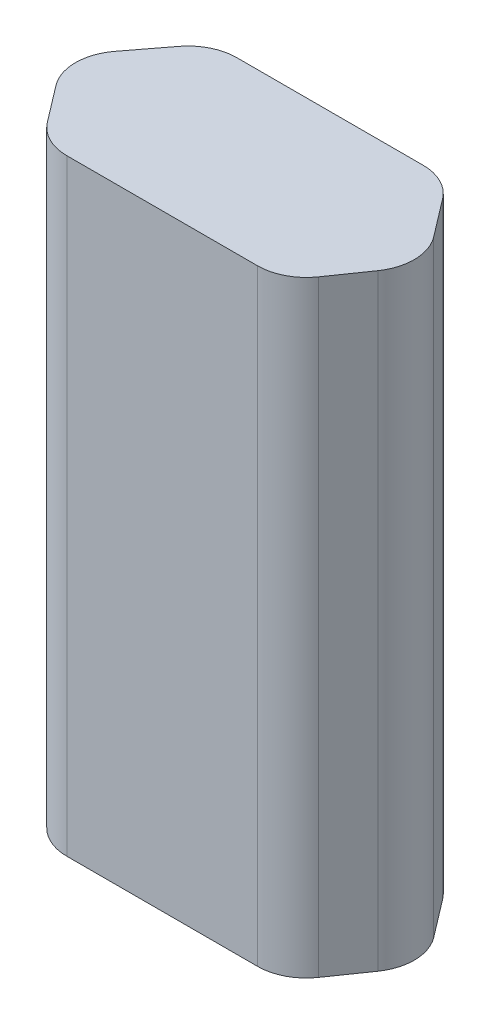
ISO-10303-21;
HEADER;
FILE_DESCRIPTION(('STEP AP214'),'2;1');
FILE_NAME('part.step','',(''),(''),'','','');
FILE_SCHEMA(('AUTOMOTIVE_DESIGN { 1 0 10303 214 1 1 1 1 }'));
ENDSEC;
DATA;
#1=APPLICATION_CONTEXT('core data for automotive mechanical design processes');
#2=APPLICATION_PROTOCOL_DEFINITION('international standard','automotive_design',2000,#1);
#3=PRODUCT_CONTEXT('',#1,'mechanical');
#4=PRODUCT('Part','Part','',(#3));
#5=PRODUCT_RELATED_PRODUCT_CATEGORY('part','',(#4));
#6=PRODUCT_DEFINITION_FORMATION('','',#4);
#7=PRODUCT_DEFINITION_CONTEXT('part definition',#1,'design');
#8=PRODUCT_DEFINITION('design','',#6,#7);
#9=PRODUCT_DEFINITION_SHAPE('','',#8);
#10=(LENGTH_UNIT() NAMED_UNIT(*) SI_UNIT(.MILLI.,.METRE.));
#11=(NAMED_UNIT(*) PLANE_ANGLE_UNIT() SI_UNIT($,.RADIAN.));
#12=(NAMED_UNIT(*) SI_UNIT($,.STERADIAN.) SOLID_ANGLE_UNIT());
#13=UNCERTAINTY_MEASURE_WITH_UNIT(LENGTH_MEASURE(1.E-05),#10,'distance_accuracy_value','');
#14=(GEOMETRIC_REPRESENTATION_CONTEXT(3) GLOBAL_UNCERTAINTY_ASSIGNED_CONTEXT((#13)) GLOBAL_UNIT_ASSIGNED_CONTEXT((#10,
#11,#12)) REPRESENTATION_CONTEXT('',''));
#15=CARTESIAN_POINT('',(0.,0.,0.));
#16=DIRECTION('',(0.,0.,1.));
#17=DIRECTION('',(1.,0.,0.));
#18=AXIS2_PLACEMENT_3D('',#15,#16,#17);
#19=CARTESIAN_POINT('',(-7.5,25.,0.));
#20=DIRECTION('',(0.795203484748346,0.,-0.606342657120614));
#21=DIRECTION('',(-0.606342657120614,0.,-0.795203484748346));
#22=AXIS2_PLACEMENT_3D('',#19,#20,#21);
#23=PLANE('',#22);
#24=DIRECTION('',(0.606342657120614,0.,0.795203484748346));
#25=VECTOR('',#24,1.);
#26=CARTESIAN_POINT('',(-7.5,0.,0.));
#27=LINE('',#26,#25);
#28=CARTESIAN_POINT('',(-6.57532744789106,0.,1.21268531424123));
#29=VERTEX_POINT('',#28);
#30=CARTESIAN_POINT('',(-5.43157744789106,0.,2.71268531424123));
#31=VERTEX_POINT('',#30);
#32=EDGE_CURVE('E154',#29,#31,#27,.T.);
#33=ORIENTED_EDGE('',*,*,#32,.T.);
#34=DIRECTION('',(0.,-1.,0.));
#35=VECTOR('',#34,1.);
#36=CARTESIAN_POINT('',(-5.43157744789106,25.,2.71268531424123));
#37=LINE('',#36,#35);
#38=CARTESIAN_POINT('',(-5.43157744789106,25.,2.71268531424123));
#39=VERTEX_POINT('',#38);
#40=EDGE_CURVE('E200',#31,#39,#37,.F.);
#41=ORIENTED_EDGE('',*,*,#40,.T.);
#42=DIRECTION('',(0.606342657120614,0.,0.795203484748346));
#43=VECTOR('',#42,1.);
#44=CARTESIAN_POINT('',(-7.5,25.,0.));
#45=LINE('',#44,#43);
#46=CARTESIAN_POINT('',(-6.57532744789106,25.,1.21268531424123));
#47=VERTEX_POINT('',#46);
#48=EDGE_CURVE('E162',#47,#39,#45,.T.);
#49=ORIENTED_EDGE('',*,*,#48,.F.);
#50=DIRECTION('',(0.,-1.,0.));
#51=VECTOR('',#50,1.);
#52=CARTESIAN_POINT('',(-6.57532744789106,25.,1.21268531424123));
#53=LINE('',#52,#51);
#54=EDGE_CURVE('E197',#47,#29,#53,.T.);
#55=ORIENTED_EDGE('',*,*,#54,.T.);
#56=EDGE_LOOP('',(#33,#41,#49,#55));
#57=FACE_BOUND('',#56,.T.);
#58=ADVANCED_FACE('F32',(#57),#23,.F.);
#59=CARTESIAN_POINT('',(-4.83125,25.,3.5));
#60=DIRECTION('',(0.,0.,-1.));
#61=DIRECTION('',(-1.,0.,0.));
#62=AXIS2_PLACEMENT_3D('',#59,#60,#61);
#63=PLANE('',#62);
#64=DIRECTION('',(1.,0.,0.));
#65=VECTOR('',#64,1.);
#66=CARTESIAN_POINT('',(-4.83125,0.,3.5));
#67=LINE('',#66,#65);
#68=CARTESIAN_POINT('',(-3.84117047839437,0.,3.5));
#69=VERTEX_POINT('',#68);
#70=CARTESIAN_POINT('',(4.02285301150582,0.,3.5));
#71=VERTEX_POINT('',#70);
#72=EDGE_CURVE('E149',#69,#71,#67,.T.);
#73=ORIENTED_EDGE('',*,*,#72,.T.);
#74=DIRECTION('',(0.,-1.,0.));
#75=VECTOR('',#74,1.);
#76=CARTESIAN_POINT('',(4.02285301150582,25.,3.5));
#77=LINE('',#76,#75);
#78=CARTESIAN_POINT('',(4.02285301150582,25.,3.5));
#79=VERTEX_POINT('',#78);
#80=EDGE_CURVE('E127',#71,#79,#77,.F.);
#81=ORIENTED_EDGE('',*,*,#80,.T.);
#82=DIRECTION('',(1.,0.,0.));
#83=VECTOR('',#82,1.);
#84=CARTESIAN_POINT('',(-4.83125,25.,3.5));
#85=LINE('',#84,#83);
#86=CARTESIAN_POINT('',(-3.84117047839437,25.,3.5));
#87=VERTEX_POINT('',#86);
#88=EDGE_CURVE('E214',#87,#79,#85,.T.);
#89=ORIENTED_EDGE('',*,*,#88,.F.);
#90=DIRECTION('',(0.,-1.,0.));
#91=VECTOR('',#90,1.);
#92=CARTESIAN_POINT('',(-3.84117047839437,25.,3.5));
#93=LINE('',#92,#91);
#94=EDGE_CURVE('E132',#87,#69,#93,.T.);
#95=ORIENTED_EDGE('',*,*,#94,.T.);
#96=EDGE_LOOP('',(#73,#81,#89,#95));
#97=FACE_BOUND('',#96,.T.);
#98=ADVANCED_FACE('F219',(#97),#63,.F.);
#99=CARTESIAN_POINT('',(7.5,25.,0.));
#100=DIRECTION('',(-0.821293612884526,0.,-0.570505741807287));
#101=DIRECTION('',(-0.570505741807287,0.,0.821293612884526));
#102=AXIS2_PLACEMENT_3D('',#99,#100,#101);
#103=PLANE('',#102);
#104=DIRECTION('',(0.570505741807287,0.,-0.821293612884526));
#105=VECTOR('',#104,1.);
#106=CARTESIAN_POINT('',(7.5,25.,0.));
#107=LINE('',#106,#105);
#108=CARTESIAN_POINT('',(5.66544023727488,25.,2.64101148361457));
#109=VERTEX_POINT('',#108);
#110=CARTESIAN_POINT('',(6.6693164561715,25.,1.1958426337891));
#111=VERTEX_POINT('',#110);
#112=EDGE_CURVE('E142',#109,#111,#107,.T.);
#113=ORIENTED_EDGE('',*,*,#112,.F.);
#114=DIRECTION('',(0.,-1.,0.));
#115=VECTOR('',#114,1.);
#116=CARTESIAN_POINT('',(5.66544023727488,25.,2.64101148361457));
#117=LINE('',#116,#115);
#118=CARTESIAN_POINT('',(5.66544023727488,0.,2.64101148361457));
#119=VERTEX_POINT('',#118);
#120=EDGE_CURVE('E126',#109,#119,#117,.T.);
#121=ORIENTED_EDGE('',*,*,#120,.T.);
#122=DIRECTION('',(0.570505741807287,0.,-0.821293612884526));
#123=VECTOR('',#122,1.);
#124=CARTESIAN_POINT('',(7.5,0.,0.));
#125=LINE('',#124,#123);
#126=CARTESIAN_POINT('',(6.6693164561715,0.,1.1958426337891));
#127=VERTEX_POINT('',#126);
#128=EDGE_CURVE('E139',#119,#127,#125,.T.);
#129=ORIENTED_EDGE('',*,*,#128,.T.);
#130=DIRECTION('',(0.,-1.,0.));
#131=VECTOR('',#130,1.);
#132=CARTESIAN_POINT('',(6.6693164561715,25.,1.1958426337891));
#133=LINE('',#132,#131);
#134=EDGE_CURVE('E144',#127,#111,#133,.F.);
#135=ORIENTED_EDGE('',*,*,#134,.T.);
#136=EDGE_LOOP('',(#113,#121,#129,#135));
#137=FACE_BOUND('',#136,.T.);
#138=ADVANCED_FACE('F138',(#137),#103,.F.);
#139=CARTESIAN_POINT('',(7.5,25.,0.));
#140=DIRECTION('',(-0.795203484748346,0.,0.606342657120614));
#141=DIRECTION('',(0.606342657120614,0.,0.795203484748346));
#142=AXIS2_PLACEMENT_3D('',#139,#140,#141);
#143=PLANE('',#142);
#144=DIRECTION('',(-0.606342657120614,0.,-0.795203484748346));
#145=VECTOR('',#144,1.);
#146=CARTESIAN_POINT('',(7.5,25.,0.));
#147=LINE('',#146,#145);
#148=CARTESIAN_POINT('',(6.61713619989914,25.,-1.1578541640667));
#149=VERTEX_POINT('',#148);
#150=CARTESIAN_POINT('',(5.43157744789106,25.,-2.71268531424123));
#151=VERTEX_POINT('',#150);
#152=EDGE_CURVE('E225',#149,#151,#147,.T.);
#153=ORIENTED_EDGE('',*,*,#152,.F.);
#154=DIRECTION('',(0.,-1.,0.));
#155=VECTOR('',#154,1.);
#156=CARTESIAN_POINT('',(6.61713619989914,25.,-1.1578541640667));
#157=LINE('',#156,#155);
#158=CARTESIAN_POINT('',(6.61713619989914,0.,-1.1578541640667));
#159=VERTEX_POINT('',#158);
#160=EDGE_CURVE('E189',#149,#159,#157,.T.);
#161=ORIENTED_EDGE('',*,*,#160,.T.);
#162=DIRECTION('',(-0.606342657120614,0.,-0.795203484748346));
#163=VECTOR('',#162,1.);
#164=CARTESIAN_POINT('',(7.5,0.,0.));
#165=LINE('',#164,#163);
#166=CARTESIAN_POINT('',(5.43157744789106,0.,-2.71268531424123));
#167=VERTEX_POINT('',#166);
#168=EDGE_CURVE('E148',#159,#167,#165,.T.);
#169=ORIENTED_EDGE('',*,*,#168,.T.);
#170=DIRECTION('',(0.,-1.,0.));
#171=VECTOR('',#170,1.);
#172=CARTESIAN_POINT('',(5.43157744789106,25.,-2.71268531424123));
#173=LINE('',#172,#171);
#174=EDGE_CURVE('E187',#167,#151,#173,.F.);
#175=ORIENTED_EDGE('',*,*,#174,.T.);
#176=EDGE_LOOP('',(#153,#161,#169,#175));
#177=FACE_BOUND('',#176,.T.);
#178=ADVANCED_FACE('F235',(#177),#143,.F.);
#179=CARTESIAN_POINT('',(-4.83125,25.,-3.5));
#180=DIRECTION('',(0.,0.,1.));
#181=DIRECTION('',(1.,0.,0.));
#182=AXIS2_PLACEMENT_3D('',#179,#180,#181);
#183=PLANE('',#182);
#184=DIRECTION('',(-1.,0.,0.));
#185=VECTOR('',#184,1.);
#186=CARTESIAN_POINT('',(-4.83125,25.,-3.5));
#187=LINE('',#186,#185);
#188=CARTESIAN_POINT('',(3.84117047839437,25.,-3.5));
#189=VERTEX_POINT('',#188);
#190=CARTESIAN_POINT('',(-3.84117047839437,25.,-3.5));
#191=VERTEX_POINT('',#190);
#192=EDGE_CURVE('E223',#189,#191,#187,.T.);
#193=ORIENTED_EDGE('',*,*,#192,.F.);
#194=DIRECTION('',(0.,-1.,0.));
#195=VECTOR('',#194,1.);
#196=CARTESIAN_POINT('',(3.84117047839437,25.,-3.5));
#197=LINE('',#196,#195);
#198=CARTESIAN_POINT('',(3.84117047839437,0.,-3.5));
#199=VERTEX_POINT('',#198);
#200=EDGE_CURVE('E194',#189,#199,#197,.T.);
#201=ORIENTED_EDGE('',*,*,#200,.T.);
#202=DIRECTION('',(-1.,0.,0.));
#203=VECTOR('',#202,1.);
#204=CARTESIAN_POINT('',(-4.83125,0.,-3.5));
#205=LINE('',#204,#203);
#206=CARTESIAN_POINT('',(-3.84117047839437,0.,-3.5));
#207=VERTEX_POINT('',#206);
#208=EDGE_CURVE('E152',#199,#207,#205,.T.);
#209=ORIENTED_EDGE('',*,*,#208,.T.);
#210=DIRECTION('',(0.,-1.,0.));
#211=VECTOR('',#210,1.);
#212=CARTESIAN_POINT('',(-3.84117047839437,25.,-3.5));
#213=LINE('',#212,#211);
#214=EDGE_CURVE('E192',#207,#191,#213,.F.);
#215=ORIENTED_EDGE('',*,*,#214,.T.);
#216=EDGE_LOOP('',(#193,#201,#209,#215));
#217=FACE_BOUND('',#216,.T.);
#218=ADVANCED_FACE('F244',(#217),#183,.F.);
#219=CARTESIAN_POINT('',(-7.5,25.,0.));
#220=DIRECTION('',(0.795203484748346,0.,0.606342657120614));
#221=DIRECTION('',(0.606342657120614,0.,-0.795203484748346));
#222=AXIS2_PLACEMENT_3D('',#219,#220,#221);
#223=PLANE('',#222);
#224=DIRECTION('',(-0.606342657120614,0.,0.795203484748346));
#225=VECTOR('',#224,1.);
#226=CARTESIAN_POINT('',(-7.5,25.,0.));
#227=LINE('',#226,#225);
#228=CARTESIAN_POINT('',(-5.43157744789106,25.,-2.71268531424123));
#229=VERTEX_POINT('',#228);
#230=CARTESIAN_POINT('',(-6.57532744789106,25.,-1.21268531424123));
#231=VERTEX_POINT('',#230);
#232=EDGE_CURVE('E163',#229,#231,#227,.T.);
#233=ORIENTED_EDGE('',*,*,#232,.F.);
#234=DIRECTION('',(0.,-1.,0.));
#235=VECTOR('',#234,1.);
#236=CARTESIAN_POINT('',(-5.43157744789106,25.,-2.71268531424123));
#237=LINE('',#236,#235);
#238=CARTESIAN_POINT('',(-5.43157744789106,0.,-2.71268531424123));
#239=VERTEX_POINT('',#238);
#240=EDGE_CURVE('E11',#229,#239,#237,.T.);
#241=ORIENTED_EDGE('',*,*,#240,.T.);
#242=DIRECTION('',(-0.606342657120614,0.,0.795203484748346));
#243=VECTOR('',#242,1.);
#244=CARTESIAN_POINT('',(-7.5,0.,0.));
#245=LINE('',#244,#243);
#246=CARTESIAN_POINT('',(-6.57532744789106,0.,-1.21268531424123));
#247=VERTEX_POINT('',#246);
#248=EDGE_CURVE('E160',#239,#247,#245,.T.);
#249=ORIENTED_EDGE('',*,*,#248,.T.);
#250=DIRECTION('',(0.,-1.,0.));
#251=VECTOR('',#250,1.);
#252=CARTESIAN_POINT('',(-6.57532744789106,25.,-1.21268531424123));
#253=LINE('',#252,#251);
#254=EDGE_CURVE('E40',#247,#231,#253,.F.);
#255=ORIENTED_EDGE('',*,*,#254,.T.);
#256=EDGE_LOOP('',(#233,#241,#249,#255));
#257=FACE_BOUND('',#256,.T.);
#258=ADVANCED_FACE('F249',(#257),#223,.F.);
#259=CARTESIAN_POINT('',(0.,25.,0.));
#260=DIRECTION('',(0.,1.,0.));
#261=DIRECTION('',(0.,0.,1.));
#262=AXIS2_PLACEMENT_3D('',#259,#260,#261);
#263=PLANE('',#262);
#264=ORIENTED_EDGE('',*,*,#88,.T.);
#265=CARTESIAN_POINT('',(4.02285301150582,25.,1.5));
#266=DIRECTION('',(0.,1.,0.));
#267=DIRECTION('',(0.,0.,1.));
#268=AXIS2_PLACEMENT_3D('',#265,#266,#267);
#269=CIRCLE('',#268,2.);
#270=EDGE_CURVE('E185',#79,#109,#269,.T.);
#271=ORIENTED_EDGE('',*,*,#270,.T.);
#272=ORIENTED_EDGE('',*,*,#112,.T.);
#273=CARTESIAN_POINT('',(5.02672923040245,25.,0.0548311501745267));
#274=DIRECTION('',(0.,1.,0.));
#275=DIRECTION('',(0.,0.,1.));
#276=AXIS2_PLACEMENT_3D('',#273,#274,#275);
#277=CIRCLE('',#276,2.);
#278=EDGE_CURVE('E183',#111,#149,#277,.T.);
#279=ORIENTED_EDGE('',*,*,#278,.T.);
#280=ORIENTED_EDGE('',*,*,#152,.T.);
#281=CARTESIAN_POINT('',(3.84117047839437,25.,-1.5));
#282=DIRECTION('',(0.,1.,0.));
#283=DIRECTION('',(0.,0.,1.));
#284=AXIS2_PLACEMENT_3D('',#281,#282,#283);
#285=CIRCLE('',#284,2.);
#286=EDGE_CURVE('E181',#151,#189,#285,.T.);
#287=ORIENTED_EDGE('',*,*,#286,.T.);
#288=ORIENTED_EDGE('',*,*,#192,.T.);
#289=CARTESIAN_POINT('',(-3.84117047839437,25.,-1.5));
#290=DIRECTION('',(0.,1.,0.));
#291=DIRECTION('',(0.,0.,1.));
#292=AXIS2_PLACEMENT_3D('',#289,#290,#291);
#293=CIRCLE('',#292,2.);
#294=EDGE_CURVE('E53',#191,#229,#293,.T.);
#295=ORIENTED_EDGE('',*,*,#294,.T.);
#296=ORIENTED_EDGE('',*,*,#232,.T.);
#297=CARTESIAN_POINT('',(-4.98492047839437,25.,0.));
#298=DIRECTION('',(0.,1.,0.));
#299=DIRECTION('',(0.,0.,1.));
#300=AXIS2_PLACEMENT_3D('',#297,#298,#299);
#301=CIRCLE('',#300,2.);
#302=EDGE_CURVE('E176',#231,#47,#301,.T.);
#303=ORIENTED_EDGE('',*,*,#302,.T.);
#304=ORIENTED_EDGE('',*,*,#48,.T.);
#305=CARTESIAN_POINT('',(-3.84117047839437,25.,1.5));
#306=DIRECTION('',(0.,1.,0.));
#307=DIRECTION('',(0.,0.,1.));
#308=AXIS2_PLACEMENT_3D('',#305,#306,#307);
#309=CIRCLE('',#308,2.);
#310=EDGE_CURVE('E179',#39,#87,#309,.T.);
#311=ORIENTED_EDGE('',*,*,#310,.T.);
#312=EDGE_LOOP('',(#264,#271,#272,#279,#280,#287,#288,#295,#296,#303,#304,#311));
#313=FACE_BOUND('',#312,.T.);
#314=ADVANCED_FACE('F211',(#313),#263,.T.);
#315=CARTESIAN_POINT('',(0.,0.,0.));
#316=DIRECTION('',(0.,1.,0.));
#317=DIRECTION('',(0.,0.,1.));
#318=AXIS2_PLACEMENT_3D('',#315,#316,#317);
#319=PLANE('',#318);
#320=ORIENTED_EDGE('',*,*,#128,.F.);
#321=CARTESIAN_POINT('',(4.02285301150582,0.,1.5));
#322=DIRECTION('',(0.,1.,0.));
#323=DIRECTION('',(0.,0.,1.));
#324=AXIS2_PLACEMENT_3D('',#321,#322,#323);
#325=CIRCLE('',#324,2.);
#326=EDGE_CURVE('E122',#119,#71,#325,.F.);
#327=ORIENTED_EDGE('',*,*,#326,.T.);
#328=ORIENTED_EDGE('',*,*,#72,.F.);
#329=CARTESIAN_POINT('',(-3.84117047839437,0.,1.5));
#330=DIRECTION('',(0.,1.,0.));
#331=DIRECTION('',(0.,0.,1.));
#332=AXIS2_PLACEMENT_3D('',#329,#330,#331);
#333=CIRCLE('',#332,2.);
#334=EDGE_CURVE('E168',#69,#31,#333,.F.);
#335=ORIENTED_EDGE('',*,*,#334,.T.);
#336=ORIENTED_EDGE('',*,*,#32,.F.);
#337=CARTESIAN_POINT('',(-4.98492047839437,0.,0.));
#338=DIRECTION('',(0.,1.,0.));
#339=DIRECTION('',(0.,0.,1.));
#340=AXIS2_PLACEMENT_3D('',#337,#338,#339);
#341=CIRCLE('',#340,2.);
#342=EDGE_CURVE('E143',#29,#247,#341,.F.);
#343=ORIENTED_EDGE('',*,*,#342,.T.);
#344=ORIENTED_EDGE('',*,*,#248,.F.);
#345=CARTESIAN_POINT('',(-3.84117047839437,0.,-1.5));
#346=DIRECTION('',(0.,1.,0.));
#347=DIRECTION('',(0.,0.,1.));
#348=AXIS2_PLACEMENT_3D('',#345,#346,#347);
#349=CIRCLE('',#348,2.);
#350=EDGE_CURVE('E166',#239,#207,#349,.F.);
#351=ORIENTED_EDGE('',*,*,#350,.T.);
#352=ORIENTED_EDGE('',*,*,#208,.F.);
#353=CARTESIAN_POINT('',(3.84117047839437,0.,-1.5));
#354=DIRECTION('',(0.,1.,0.));
#355=DIRECTION('',(0.,0.,1.));
#356=AXIS2_PLACEMENT_3D('',#353,#354,#355);
#357=CIRCLE('',#356,2.);
#358=EDGE_CURVE('E170',#199,#167,#357,.F.);
#359=ORIENTED_EDGE('',*,*,#358,.T.);
#360=ORIENTED_EDGE('',*,*,#168,.F.);
#361=CARTESIAN_POINT('',(5.02672923040245,0.,0.0548311501745267));
#362=DIRECTION('',(0.,1.,0.));
#363=DIRECTION('',(0.,0.,1.));
#364=AXIS2_PLACEMENT_3D('',#361,#362,#363);
#365=CIRCLE('',#364,2.);
#366=EDGE_CURVE('E133',#159,#127,#365,.F.);
#367=ORIENTED_EDGE('',*,*,#366,.T.);
#368=EDGE_LOOP('',(#320,#327,#328,#335,#336,#343,#344,#351,#352,#359,#360,#367));
#369=FACE_BOUND('',#368,.T.);
#370=ADVANCED_FACE('F146',(#369),#319,.F.);
#371=CARTESIAN_POINT('',(4.02285301150582,25.,1.5));
#372=DIRECTION('',(0.,-1.,0.));
#373=DIRECTION('',(0.,0.,-1.));
#374=AXIS2_PLACEMENT_3D('',#371,#372,#373);
#375=CYLINDRICAL_SURFACE('',#374,2.);
#376=ORIENTED_EDGE('',*,*,#270,.F.);
#377=ORIENTED_EDGE('',*,*,#80,.F.);
#378=ORIENTED_EDGE('',*,*,#326,.F.);
#379=ORIENTED_EDGE('',*,*,#120,.F.);
#380=EDGE_LOOP('',(#376,#377,#378,#379));
#381=FACE_BOUND('',#380,.T.);
#382=ADVANCED_FACE('F125',(#381),#375,.T.);
#383=CARTESIAN_POINT('',(5.02672923040245,25.,0.0548311501745267));
#384=DIRECTION('',(0.,-1.,0.));
#385=DIRECTION('',(0.,0.,-1.));
#386=AXIS2_PLACEMENT_3D('',#383,#384,#385);
#387=CYLINDRICAL_SURFACE('',#386,2.);
#388=ORIENTED_EDGE('',*,*,#278,.F.);
#389=ORIENTED_EDGE('',*,*,#134,.F.);
#390=ORIENTED_EDGE('',*,*,#366,.F.);
#391=ORIENTED_EDGE('',*,*,#160,.F.);
#392=EDGE_LOOP('',(#388,#389,#390,#391));
#393=FACE_BOUND('',#392,.T.);
#394=ADVANCED_FACE('F233',(#393),#387,.T.);
#395=CARTESIAN_POINT('',(3.84117047839437,25.,-1.5));
#396=DIRECTION('',(0.,-1.,0.));
#397=DIRECTION('',(0.,0.,-1.));
#398=AXIS2_PLACEMENT_3D('',#395,#396,#397);
#399=CYLINDRICAL_SURFACE('',#398,2.);
#400=ORIENTED_EDGE('',*,*,#286,.F.);
#401=ORIENTED_EDGE('',*,*,#174,.F.);
#402=ORIENTED_EDGE('',*,*,#358,.F.);
#403=ORIENTED_EDGE('',*,*,#200,.F.);
#404=EDGE_LOOP('',(#400,#401,#402,#403));
#405=FACE_BOUND('',#404,.T.);
#406=ADVANCED_FACE('F241',(#405),#399,.T.);
#407=CARTESIAN_POINT('',(-3.84117047839437,25.,1.5));
#408=DIRECTION('',(0.,-1.,0.));
#409=DIRECTION('',(0.,0.,-1.));
#410=AXIS2_PLACEMENT_3D('',#407,#408,#409);
#411=CYLINDRICAL_SURFACE('',#410,2.);
#412=ORIENTED_EDGE('',*,*,#310,.F.);
#413=ORIENTED_EDGE('',*,*,#40,.F.);
#414=ORIENTED_EDGE('',*,*,#334,.F.);
#415=ORIENTED_EDGE('',*,*,#94,.F.);
#416=EDGE_LOOP('',(#412,#413,#414,#415));
#417=FACE_BOUND('',#416,.T.);
#418=ADVANCED_FACE('F217',(#417),#411,.T.);
#419=CARTESIAN_POINT('',(-3.84117047839437,25.,-1.5));
#420=DIRECTION('',(0.,-1.,0.));
#421=DIRECTION('',(0.,0.,-1.));
#422=AXIS2_PLACEMENT_3D('',#419,#420,#421);
#423=CYLINDRICAL_SURFACE('',#422,2.);
#424=ORIENTED_EDGE('',*,*,#294,.F.);
#425=ORIENTED_EDGE('',*,*,#214,.F.);
#426=ORIENTED_EDGE('',*,*,#350,.F.);
#427=ORIENTED_EDGE('',*,*,#240,.F.);
#428=EDGE_LOOP('',(#424,#425,#426,#427));
#429=FACE_BOUND('',#428,.T.);
#430=ADVANCED_FACE('F248',(#429),#423,.T.);
#431=CARTESIAN_POINT('',(-4.98492047839437,25.,0.));
#432=DIRECTION('',(0.,-1.,0.));
#433=DIRECTION('',(0.,0.,-1.));
#434=AXIS2_PLACEMENT_3D('',#431,#432,#433);
#435=CYLINDRICAL_SURFACE('',#434,2.);
#436=ORIENTED_EDGE('',*,*,#302,.F.);
#437=ORIENTED_EDGE('',*,*,#254,.F.);
#438=ORIENTED_EDGE('',*,*,#342,.F.);
#439=ORIENTED_EDGE('',*,*,#54,.F.);
#440=EDGE_LOOP('',(#436,#437,#438,#439));
#441=FACE_BOUND('',#440,.T.);
#442=ADVANCED_FACE('F34',(#441),#435,.T.);
#443=CLOSED_SHELL('',(#58,#98,#138,#178,#218,#258,#314,#370,#382,#394,#406,#418,#430,#442));
#444=MANIFOLD_SOLID_BREP('B2',#443);
#445=ADVANCED_BREP_SHAPE_REPRESENTATION('',(#18,#444),#14);
#446=SHAPE_DEFINITION_REPRESENTATION(#9,#445);
ENDSEC;
END-ISO-10303-21;
